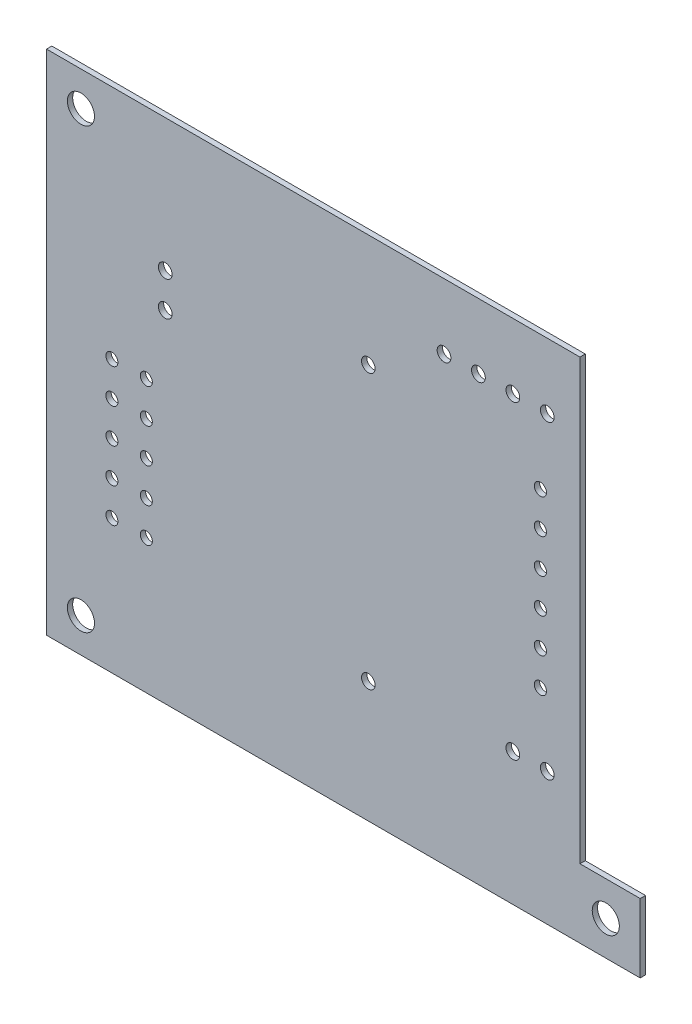
ISO-10303-21;
HEADER;
FILE_DESCRIPTION(('STEP AP214'),'2;1');
FILE_NAME('part.step','',(''),(''),'','','');
FILE_SCHEMA(('AUTOMOTIVE_DESIGN { 1 0 10303 214 1 1 1 1 }'));
ENDSEC;
DATA;
#1=APPLICATION_CONTEXT('core data for automotive mechanical design processes');
#2=APPLICATION_PROTOCOL_DEFINITION('international standard','automotive_design',2000,#1);
#3=PRODUCT_CONTEXT('',#1,'mechanical');
#4=PRODUCT('Part','Part','',(#3));
#5=PRODUCT_RELATED_PRODUCT_CATEGORY('part','',(#4));
#6=PRODUCT_DEFINITION_FORMATION('','',#4);
#7=PRODUCT_DEFINITION_CONTEXT('part definition',#1,'design');
#8=PRODUCT_DEFINITION('design','',#6,#7);
#9=PRODUCT_DEFINITION_SHAPE('','',#8);
#10=(LENGTH_UNIT() NAMED_UNIT(*) SI_UNIT(.MILLI.,.METRE.));
#11=(NAMED_UNIT(*) PLANE_ANGLE_UNIT() SI_UNIT($,.RADIAN.));
#12=(NAMED_UNIT(*) SI_UNIT($,.STERADIAN.) SOLID_ANGLE_UNIT());
#13=UNCERTAINTY_MEASURE_WITH_UNIT(LENGTH_MEASURE(1.E-05),#10,'distance_accuracy_value','');
#14=(GEOMETRIC_REPRESENTATION_CONTEXT(3) GLOBAL_UNCERTAINTY_ASSIGNED_CONTEXT((#13)) GLOBAL_UNIT_ASSIGNED_CONTEXT((#10,
#11,#12)) REPRESENTATION_CONTEXT('',''));
#15=CARTESIAN_POINT('',(0.,0.,0.));
#16=DIRECTION('',(0.,0.,1.));
#17=DIRECTION('',(1.,0.,0.));
#18=AXIS2_PLACEMENT_3D('',#15,#16,#17);
#19=CARTESIAN_POINT('',(39.37,37.465,0.));
#20=DIRECTION('',(0.,0.,-1.));
#21=DIRECTION('',(-1.,0.,0.));
#22=AXIS2_PLACEMENT_3D('',#19,#20,#21);
#23=PLANE('',#22);
#24=CARTESIAN_POINT('',(36.957,32.639,0.));
#25=DIRECTION('',(0.,0.,-1.));
#26=DIRECTION('',(-1.,0.,0.));
#27=AXIS2_PLACEMENT_3D('',#24,#25,#26);
#28=CIRCLE('',#27,0.508);
#29=CARTESIAN_POINT('',(36.449,32.639,0.));
#30=VERTEX_POINT('',#29);
#31=EDGE_CURVE('E176',#30,#30,#28,.F.);
#32=ORIENTED_EDGE('',*,*,#31,.T.);
#33=EDGE_LOOP('',(#32));
#34=FACE_BOUND('',#33,.T.);
#35=CARTESIAN_POINT('',(36.449,27.559,0.));
#36=DIRECTION('',(0.,0.,-1.));
#37=DIRECTION('',(-1.,0.,0.));
#38=AXIS2_PLACEMENT_3D('',#35,#36,#37);
#39=CIRCLE('',#38,0.4499991);
#40=CARTESIAN_POINT('',(35.9990009,27.559,0.));
#41=VERTEX_POINT('',#40);
#42=EDGE_CURVE('E179',#41,#41,#39,.F.);
#43=ORIENTED_EDGE('',*,*,#42,.T.);
#44=EDGE_LOOP('',(#43));
#45=FACE_BOUND('',#44,.T.);
#46=CARTESIAN_POINT('',(36.449,19.939,0.));
#47=DIRECTION('',(0.,0.,-1.));
#48=DIRECTION('',(-1.,0.,0.));
#49=AXIS2_PLACEMENT_3D('',#46,#47,#48);
#50=CIRCLE('',#49,0.4499991);
#51=CARTESIAN_POINT('',(35.9990009,19.939,0.));
#52=VERTEX_POINT('',#51);
#53=EDGE_CURVE('E182',#52,#52,#50,.F.);
#54=ORIENTED_EDGE('',*,*,#53,.T.);
#55=EDGE_LOOP('',(#54));
#56=FACE_BOUND('',#55,.T.);
#57=CARTESIAN_POINT('',(36.449,25.019,0.));
#58=DIRECTION('',(0.,0.,-1.));
#59=DIRECTION('',(-1.,0.,0.));
#60=AXIS2_PLACEMENT_3D('',#57,#58,#59);
#61=CIRCLE('',#60,0.4499991);
#62=CARTESIAN_POINT('',(35.9990009,25.019,0.));
#63=VERTEX_POINT('',#62);
#64=EDGE_CURVE('E185',#63,#63,#61,.F.);
#65=ORIENTED_EDGE('',*,*,#64,.T.);
#66=EDGE_LOOP('',(#65));
#67=FACE_BOUND('',#66,.T.);
#68=CARTESIAN_POINT('',(31.877,32.639,0.));
#69=DIRECTION('',(0.,0.,-1.));
#70=DIRECTION('',(-1.,0.,0.));
#71=AXIS2_PLACEMENT_3D('',#68,#69,#70);
#72=CIRCLE('',#71,0.508);
#73=CARTESIAN_POINT('',(31.369,32.639,0.));
#74=VERTEX_POINT('',#73);
#75=EDGE_CURVE('E188',#74,#74,#72,.F.);
#76=ORIENTED_EDGE('',*,*,#75,.T.);
#77=EDGE_LOOP('',(#76));
#78=FACE_BOUND('',#77,.T.);
#79=CARTESIAN_POINT('',(29.337,32.639,0.));
#80=DIRECTION('',(0.,0.,-1.));
#81=DIRECTION('',(-1.,0.,0.));
#82=AXIS2_PLACEMENT_3D('',#79,#80,#81);
#83=CIRCLE('',#82,0.508);
#84=CARTESIAN_POINT('',(28.829,32.639,0.));
#85=VERTEX_POINT('',#84);
#86=EDGE_CURVE('E191',#85,#85,#83,.F.);
#87=ORIENTED_EDGE('',*,*,#86,.T.);
#88=EDGE_LOOP('',(#87));
#89=FACE_BOUND('',#88,.T.);
#90=CARTESIAN_POINT('',(36.449,22.479,0.));
#91=DIRECTION('',(0.,0.,-1.));
#92=DIRECTION('',(-1.,0.,0.));
#93=AXIS2_PLACEMENT_3D('',#90,#91,#92);
#94=CIRCLE('',#93,0.4499991);
#95=CARTESIAN_POINT('',(35.9990009,22.479,0.));
#96=VERTEX_POINT('',#95);
#97=EDGE_CURVE('E194',#96,#96,#94,.F.);
#98=ORIENTED_EDGE('',*,*,#97,.T.);
#99=EDGE_LOOP('',(#98));
#100=FACE_BOUND('',#99,.T.);
#101=CARTESIAN_POINT('',(34.417,32.639,0.));
#102=DIRECTION('',(0.,0.,-1.));
#103=DIRECTION('',(-1.,0.,0.));
#104=AXIS2_PLACEMENT_3D('',#101,#102,#103);
#105=CIRCLE('',#104,0.508);
#106=CARTESIAN_POINT('',(33.909,32.639,0.));
#107=VERTEX_POINT('',#106);
#108=EDGE_CURVE('E197',#107,#107,#105,.F.);
#109=ORIENTED_EDGE('',*,*,#108,.T.);
#110=EDGE_LOOP('',(#109));
#111=FACE_BOUND('',#110,.T.);
#112=CARTESIAN_POINT('',(36.957,9.779,0.));
#113=DIRECTION('',(0.,0.,-1.));
#114=DIRECTION('',(-1.,0.,0.));
#115=AXIS2_PLACEMENT_3D('',#112,#113,#114);
#116=CIRCLE('',#115,0.508);
#117=CARTESIAN_POINT('',(36.449,9.779,0.));
#118=VERTEX_POINT('',#117);
#119=EDGE_CURVE('E200',#118,#118,#116,.F.);
#120=ORIENTED_EDGE('',*,*,#119,.T.);
#121=EDGE_LOOP('',(#120));
#122=FACE_BOUND('',#121,.T.);
#123=CARTESIAN_POINT('',(41.275,2.54,0.));
#124=DIRECTION('',(0.,0.,-1.));
#125=DIRECTION('',(-1.,0.,0.));
#126=AXIS2_PLACEMENT_3D('',#123,#124,#125);
#127=CIRCLE('',#126,1.00000054);
#128=CARTESIAN_POINT('',(40.27499946,2.54,0.));
#129=VERTEX_POINT('',#128);
#130=EDGE_CURVE('E203',#129,#129,#127,.F.);
#131=ORIENTED_EDGE('',*,*,#130,.T.);
#132=EDGE_LOOP('',(#131));
#133=FACE_BOUND('',#132,.T.);
#134=CARTESIAN_POINT('',(36.449,14.859,0.));
#135=DIRECTION('',(0.,0.,-1.));
#136=DIRECTION('',(-1.,0.,0.));
#137=AXIS2_PLACEMENT_3D('',#134,#135,#136);
#138=CIRCLE('',#137,0.4499991);
#139=CARTESIAN_POINT('',(35.9990009,14.859,0.));
#140=VERTEX_POINT('',#139);
#141=EDGE_CURVE('E206',#140,#140,#138,.F.);
#142=ORIENTED_EDGE('',*,*,#141,.T.);
#143=EDGE_LOOP('',(#142));
#144=FACE_BOUND('',#143,.T.);
#145=CARTESIAN_POINT('',(36.449,17.399,0.));
#146=DIRECTION('',(0.,0.,-1.));
#147=DIRECTION('',(-1.,0.,0.));
#148=AXIS2_PLACEMENT_3D('',#145,#146,#147);
#149=CIRCLE('',#148,0.4499991);
#150=CARTESIAN_POINT('',(35.9990009,17.399,0.));
#151=VERTEX_POINT('',#150);
#152=EDGE_CURVE('E209',#151,#151,#149,.F.);
#153=ORIENTED_EDGE('',*,*,#152,.T.);
#154=EDGE_LOOP('',(#153));
#155=FACE_BOUND('',#154,.T.);
#156=CARTESIAN_POINT('',(34.417,9.779,0.));
#157=DIRECTION('',(0.,0.,-1.));
#158=DIRECTION('',(-1.,0.,0.));
#159=AXIS2_PLACEMENT_3D('',#156,#157,#158);
#160=CIRCLE('',#159,0.508);
#161=CARTESIAN_POINT('',(33.909,9.779,0.));
#162=VERTEX_POINT('',#161);
#163=EDGE_CURVE('E212',#162,#162,#160,.F.);
#164=ORIENTED_EDGE('',*,*,#163,.T.);
#165=EDGE_LOOP('',(#164));
#166=FACE_BOUND('',#165,.T.);
#167=CARTESIAN_POINT('',(23.749,8.9339928,0.));
#168=DIRECTION('',(0.,0.,-1.));
#169=DIRECTION('',(-1.,0.,0.));
#170=AXIS2_PLACEMENT_3D('',#167,#168,#169);
#171=CIRCLE('',#170,0.499999);
#172=CARTESIAN_POINT('',(23.249001,8.9339928,0.));
#173=VERTEX_POINT('',#172);
#174=EDGE_CURVE('E215',#173,#173,#171,.F.);
#175=ORIENTED_EDGE('',*,*,#174,.T.);
#176=EDGE_LOOP('',(#175));
#177=FACE_BOUND('',#176,.T.);
#178=CARTESIAN_POINT('',(23.749,29.1589968,0.));
#179=DIRECTION('',(0.,0.,-1.));
#180=DIRECTION('',(-1.,0.,0.));
#181=AXIS2_PLACEMENT_3D('',#178,#179,#180);
#182=CIRCLE('',#181,0.499999);
#183=CARTESIAN_POINT('',(23.249001,29.1589968,0.));
#184=VERTEX_POINT('',#183);
#185=EDGE_CURVE('E218',#184,#184,#182,.F.);
#186=ORIENTED_EDGE('',*,*,#185,.T.);
#187=EDGE_LOOP('',(#186));
#188=FACE_BOUND('',#187,.T.);
#189=CARTESIAN_POINT('',(8.763,27.686,0.));
#190=DIRECTION('',(0.,0.,-1.));
#191=DIRECTION('',(-1.,0.,0.));
#192=AXIS2_PLACEMENT_3D('',#189,#190,#191);
#193=CIRCLE('',#192,0.508);
#194=CARTESIAN_POINT('',(8.255,27.686,0.));
#195=VERTEX_POINT('',#194);
#196=EDGE_CURVE('E221',#195,#195,#193,.F.);
#197=ORIENTED_EDGE('',*,*,#196,.T.);
#198=EDGE_LOOP('',(#197));
#199=FACE_BOUND('',#198,.T.);
#200=CARTESIAN_POINT('',(8.763,25.146,0.));
#201=DIRECTION('',(0.,0.,-1.));
#202=DIRECTION('',(-1.,0.,0.));
#203=AXIS2_PLACEMENT_3D('',#200,#201,#202);
#204=CIRCLE('',#203,0.508);
#205=CARTESIAN_POINT('',(8.255,25.146,0.));
#206=VERTEX_POINT('',#205);
#207=EDGE_CURVE('E224',#206,#206,#204,.F.);
#208=ORIENTED_EDGE('',*,*,#207,.T.);
#209=EDGE_LOOP('',(#208));
#210=FACE_BOUND('',#209,.T.);
#211=CARTESIAN_POINT('',(7.366,17.526,0.));
#212=DIRECTION('',(0.,0.,-1.));
#213=DIRECTION('',(-1.,0.,0.));
#214=AXIS2_PLACEMENT_3D('',#211,#212,#213);
#215=CIRCLE('',#214,0.4445);
#216=CARTESIAN_POINT('',(6.9215,17.526,0.));
#217=VERTEX_POINT('',#216);
#218=EDGE_CURVE('E227',#217,#217,#215,.F.);
#219=ORIENTED_EDGE('',*,*,#218,.T.);
#220=EDGE_LOOP('',(#219));
#221=FACE_BOUND('',#220,.T.);
#222=CARTESIAN_POINT('',(7.366,20.066,0.));
#223=DIRECTION('',(0.,0.,-1.));
#224=DIRECTION('',(-1.,0.,0.));
#225=AXIS2_PLACEMENT_3D('',#222,#223,#224);
#226=CIRCLE('',#225,0.4445);
#227=CARTESIAN_POINT('',(6.9215,20.066,0.));
#228=VERTEX_POINT('',#227);
#229=EDGE_CURVE('E230',#228,#228,#226,.F.);
#230=ORIENTED_EDGE('',*,*,#229,.T.);
#231=EDGE_LOOP('',(#230));
#232=FACE_BOUND('',#231,.T.);
#233=CARTESIAN_POINT('',(2.54,34.925,0.));
#234=DIRECTION('',(0.,0.,-1.));
#235=DIRECTION('',(-1.,0.,0.));
#236=AXIS2_PLACEMENT_3D('',#233,#234,#235);
#237=CIRCLE('',#236,1.00000054);
#238=CARTESIAN_POINT('',(1.53999946,34.925,0.));
#239=VERTEX_POINT('',#238);
#240=EDGE_CURVE('E233',#239,#239,#237,.F.);
#241=ORIENTED_EDGE('',*,*,#240,.T.);
#242=EDGE_LOOP('',(#241));
#243=FACE_BOUND('',#242,.T.);
#244=CARTESIAN_POINT('',(4.826,17.526,0.));
#245=DIRECTION('',(0.,0.,-1.));
#246=DIRECTION('',(-1.,0.,0.));
#247=AXIS2_PLACEMENT_3D('',#244,#245,#246);
#248=CIRCLE('',#247,0.4445);
#249=CARTESIAN_POINT('',(4.3815,17.526,0.));
#250=VERTEX_POINT('',#249);
#251=EDGE_CURVE('E236',#250,#250,#248,.F.);
#252=ORIENTED_EDGE('',*,*,#251,.T.);
#253=EDGE_LOOP('',(#252));
#254=FACE_BOUND('',#253,.T.);
#255=CARTESIAN_POINT('',(4.826,20.066,0.));
#256=DIRECTION('',(0.,0.,-1.));
#257=DIRECTION('',(-1.,0.,0.));
#258=AXIS2_PLACEMENT_3D('',#255,#256,#257);
#259=CIRCLE('',#258,0.4445);
#260=CARTESIAN_POINT('',(4.3815,20.066,0.));
#261=VERTEX_POINT('',#260);
#262=EDGE_CURVE('E239',#261,#261,#259,.F.);
#263=ORIENTED_EDGE('',*,*,#262,.T.);
#264=EDGE_LOOP('',(#263));
#265=FACE_BOUND('',#264,.T.);
#266=CARTESIAN_POINT('',(7.366,14.986,0.));
#267=DIRECTION('',(0.,0.,-1.));
#268=DIRECTION('',(-1.,0.,0.));
#269=AXIS2_PLACEMENT_3D('',#266,#267,#268);
#270=CIRCLE('',#269,0.4445);
#271=CARTESIAN_POINT('',(6.9215,14.986,0.));
#272=VERTEX_POINT('',#271);
#273=EDGE_CURVE('E242',#272,#272,#270,.F.);
#274=ORIENTED_EDGE('',*,*,#273,.T.);
#275=EDGE_LOOP('',(#274));
#276=FACE_BOUND('',#275,.T.);
#277=CARTESIAN_POINT('',(4.826,14.986,0.));
#278=DIRECTION('',(0.,0.,-1.));
#279=DIRECTION('',(-1.,0.,0.));
#280=AXIS2_PLACEMENT_3D('',#277,#278,#279);
#281=CIRCLE('',#280,0.4445);
#282=CARTESIAN_POINT('',(4.3815,14.986,0.));
#283=VERTEX_POINT('',#282);
#284=EDGE_CURVE('E245',#283,#283,#281,.F.);
#285=ORIENTED_EDGE('',*,*,#284,.T.);
#286=EDGE_LOOP('',(#285));
#287=FACE_BOUND('',#286,.T.);
#288=CARTESIAN_POINT('',(7.366,9.906,0.));
#289=DIRECTION('',(0.,0.,-1.));
#290=DIRECTION('',(-1.,0.,0.));
#291=AXIS2_PLACEMENT_3D('',#288,#289,#290);
#292=CIRCLE('',#291,0.4445);
#293=CARTESIAN_POINT('',(6.9215,9.906,0.));
#294=VERTEX_POINT('',#293);
#295=EDGE_CURVE('E248',#294,#294,#292,.F.);
#296=ORIENTED_EDGE('',*,*,#295,.T.);
#297=EDGE_LOOP('',(#296));
#298=FACE_BOUND('',#297,.T.);
#299=CARTESIAN_POINT('',(7.366,12.446,0.));
#300=DIRECTION('',(0.,0.,-1.));
#301=DIRECTION('',(-1.,0.,0.));
#302=AXIS2_PLACEMENT_3D('',#299,#300,#301);
#303=CIRCLE('',#302,0.4445);
#304=CARTESIAN_POINT('',(6.9215,12.446,0.));
#305=VERTEX_POINT('',#304);
#306=EDGE_CURVE('E251',#305,#305,#303,.F.);
#307=ORIENTED_EDGE('',*,*,#306,.T.);
#308=EDGE_LOOP('',(#307));
#309=FACE_BOUND('',#308,.T.);
#310=CARTESIAN_POINT('',(4.826,9.906,0.));
#311=DIRECTION('',(0.,0.,-1.));
#312=DIRECTION('',(-1.,0.,0.));
#313=AXIS2_PLACEMENT_3D('',#310,#311,#312);
#314=CIRCLE('',#313,0.4445);
#315=CARTESIAN_POINT('',(4.3815,9.906,0.));
#316=VERTEX_POINT('',#315);
#317=EDGE_CURVE('E254',#316,#316,#314,.F.);
#318=ORIENTED_EDGE('',*,*,#317,.T.);
#319=EDGE_LOOP('',(#318));
#320=FACE_BOUND('',#319,.T.);
#321=CARTESIAN_POINT('',(4.826,12.446,0.));
#322=DIRECTION('',(0.,0.,-1.));
#323=DIRECTION('',(-1.,0.,0.));
#324=AXIS2_PLACEMENT_3D('',#321,#322,#323);
#325=CIRCLE('',#324,0.4445);
#326=CARTESIAN_POINT('',(4.3815,12.446,0.));
#327=VERTEX_POINT('',#326);
#328=EDGE_CURVE('E256',#327,#327,#325,.F.);
#329=ORIENTED_EDGE('',*,*,#328,.T.);
#330=EDGE_LOOP('',(#329));
#331=FACE_BOUND('',#330,.T.);
#332=CARTESIAN_POINT('',(2.54,2.54,0.));
#333=DIRECTION('',(0.,0.,-1.));
#334=DIRECTION('',(-1.,0.,0.));
#335=AXIS2_PLACEMENT_3D('',#332,#333,#334);
#336=CIRCLE('',#335,1.00000054);
#337=CARTESIAN_POINT('',(1.53999946,2.54,0.));
#338=VERTEX_POINT('',#337);
#339=EDGE_CURVE('E20',#338,#338,#336,.F.);
#340=ORIENTED_EDGE('',*,*,#339,.T.);
#341=EDGE_LOOP('',(#340));
#342=FACE_BOUND('',#341,.T.);
#343=DIRECTION('',(0.,1.,0.));
#344=VECTOR('',#343,1.);
#345=CARTESIAN_POINT('',(0.,37.465,0.));
#346=LINE('',#345,#344);
#347=CARTESIAN_POINT('',(0.,0.,0.));
#348=VERTEX_POINT('',#347);
#349=CARTESIAN_POINT('',(0.,37.465,0.));
#350=VERTEX_POINT('',#349);
#351=EDGE_CURVE('E270',#348,#350,#346,.T.);
#352=ORIENTED_EDGE('',*,*,#351,.T.);
#353=DIRECTION('',(1.,0.,0.));
#354=VECTOR('',#353,1.);
#355=CARTESIAN_POINT('',(39.37,37.465,0.));
#356=LINE('',#355,#354);
#357=CARTESIAN_POINT('',(39.37,37.465,0.));
#358=VERTEX_POINT('',#357);
#359=EDGE_CURVE('E72',#350,#358,#356,.T.);
#360=ORIENTED_EDGE('',*,*,#359,.T.);
#361=DIRECTION('',(0.,1.,0.));
#362=VECTOR('',#361,1.);
#363=CARTESIAN_POINT('',(39.37,5.08,0.));
#364=LINE('',#363,#362);
#365=CARTESIAN_POINT('',(39.37,5.08,0.));
#366=VERTEX_POINT('',#365);
#367=EDGE_CURVE('E71',#358,#366,#364,.F.);
#368=ORIENTED_EDGE('',*,*,#367,.T.);
#369=DIRECTION('',(1.,0.,0.));
#370=VECTOR('',#369,1.);
#371=CARTESIAN_POINT('',(43.815,5.08,0.));
#372=LINE('',#371,#370);
#373=CARTESIAN_POINT('',(43.815,5.08,0.));
#374=VERTEX_POINT('',#373);
#375=EDGE_CURVE('E68',#366,#374,#372,.T.);
#376=ORIENTED_EDGE('',*,*,#375,.T.);
#377=DIRECTION('',(0.,1.,0.));
#378=VECTOR('',#377,1.);
#379=CARTESIAN_POINT('',(43.815,0.,0.));
#380=LINE('',#379,#378);
#381=CARTESIAN_POINT('',(43.815,0.,0.));
#382=VERTEX_POINT('',#381);
#383=EDGE_CURVE('E280',#374,#382,#380,.F.);
#384=ORIENTED_EDGE('',*,*,#383,.T.);
#385=DIRECTION('',(1.,0.,0.));
#386=VECTOR('',#385,1.);
#387=CARTESIAN_POINT('',(0.,0.,0.));
#388=LINE('',#387,#386);
#389=EDGE_CURVE('E275',#382,#348,#388,.F.);
#390=ORIENTED_EDGE('',*,*,#389,.T.);
#391=EDGE_LOOP('',(#352,#360,#368,#376,#384,#390));
#392=FACE_BOUND('',#391,.T.);
#393=ADVANCED_FACE('F17',(#34,#45,#56,#67,#78,#89,#100,#111,#122,#133,#144,#155,#166,#177,#188,
#199,#210,#221,#232,#243,#254,#265,#276,#287,#298,#309,#320,#331,#342,#392),#23,.T.);
#394=CARTESIAN_POINT('',(39.37,5.08,0.));
#395=DIRECTION('',(-1.,0.,0.));
#396=DIRECTION('',(0.,0.,1.));
#397=AXIS2_PLACEMENT_3D('',#394,#395,#396);
#398=PLANE('',#397);
#399=ORIENTED_EDGE('',*,*,#367,.F.);
#400=DIRECTION('',(0.,0.,-1.));
#401=VECTOR('',#400,1.);
#402=CARTESIAN_POINT('',(39.37,37.465,0.));
#403=LINE('',#402,#401);
#404=CARTESIAN_POINT('',(39.37,37.465,0.39116));
#405=VERTEX_POINT('',#404);
#406=EDGE_CURVE('E264',#358,#405,#403,.F.);
#407=ORIENTED_EDGE('',*,*,#406,.T.);
#408=DIRECTION('',(0.,1.,0.));
#409=VECTOR('',#408,1.);
#410=CARTESIAN_POINT('',(39.37,37.465,0.39116));
#411=LINE('',#410,#409);
#412=CARTESIAN_POINT('',(39.37,5.08,0.39116));
#413=VERTEX_POINT('',#412);
#414=EDGE_CURVE('E88',#405,#413,#411,.F.);
#415=ORIENTED_EDGE('',*,*,#414,.T.);
#416=DIRECTION('',(0.,0.,-1.));
#417=VECTOR('',#416,1.);
#418=CARTESIAN_POINT('',(39.37,5.08,0.));
#419=LINE('',#418,#417);
#420=EDGE_CURVE('E77',#413,#366,#419,.T.);
#421=ORIENTED_EDGE('',*,*,#420,.T.);
#422=EDGE_LOOP('',(#399,#407,#415,#421));
#423=FACE_BOUND('',#422,.T.);
#424=ADVANCED_FACE('F87',(#423),#398,.F.);
#425=CARTESIAN_POINT('',(43.815,5.08,0.));
#426=DIRECTION('',(0.,-1.,0.));
#427=DIRECTION('',(0.,0.,-1.));
#428=AXIS2_PLACEMENT_3D('',#425,#426,#427);
#429=PLANE('',#428);
#430=ORIENTED_EDGE('',*,*,#420,.F.);
#431=DIRECTION('',(-1.,0.,0.));
#432=VECTOR('',#431,1.);
#433=CARTESIAN_POINT('',(39.37,5.08,0.39116));
#434=LINE('',#433,#432);
#435=CARTESIAN_POINT('',(43.815,5.08,0.39116));
#436=VERTEX_POINT('',#435);
#437=EDGE_CURVE('E294',#413,#436,#434,.F.);
#438=ORIENTED_EDGE('',*,*,#437,.T.);
#439=DIRECTION('',(0.,0.,1.));
#440=VECTOR('',#439,1.);
#441=CARTESIAN_POINT('',(43.815,5.08,0.));
#442=LINE('',#441,#440);
#443=EDGE_CURVE('E85',#436,#374,#442,.F.);
#444=ORIENTED_EDGE('',*,*,#443,.T.);
#445=ORIENTED_EDGE('',*,*,#375,.F.);
#446=EDGE_LOOP('',(#430,#438,#444,#445));
#447=FACE_BOUND('',#446,.T.);
#448=ADVANCED_FACE('F82',(#447),#429,.F.);
#449=CARTESIAN_POINT('',(43.815,0.,0.));
#450=DIRECTION('',(-1.,0.,0.));
#451=DIRECTION('',(0.,0.,1.));
#452=AXIS2_PLACEMENT_3D('',#449,#450,#451);
#453=PLANE('',#452);
#454=ORIENTED_EDGE('',*,*,#443,.F.);
#455=DIRECTION('',(0.,1.,0.));
#456=VECTOR('',#455,1.);
#457=CARTESIAN_POINT('',(43.815,37.465,0.39116));
#458=LINE('',#457,#456);
#459=CARTESIAN_POINT('',(43.815,0.,0.39116));
#460=VERTEX_POINT('',#459);
#461=EDGE_CURVE('E291',#436,#460,#458,.F.);
#462=ORIENTED_EDGE('',*,*,#461,.T.);
#463=DIRECTION('',(0.,0.,1.));
#464=VECTOR('',#463,1.);
#465=CARTESIAN_POINT('',(43.815,0.,0.));
#466=LINE('',#465,#464);
#467=EDGE_CURVE('E277',#460,#382,#466,.F.);
#468=ORIENTED_EDGE('',*,*,#467,.T.);
#469=ORIENTED_EDGE('',*,*,#383,.F.);
#470=EDGE_LOOP('',(#454,#462,#468,#469));
#471=FACE_BOUND('',#470,.T.);
#472=ADVANCED_FACE('F289',(#471),#453,.F.);
#473=CARTESIAN_POINT('',(0.,0.,0.));
#474=DIRECTION('',(0.,1.,0.));
#475=DIRECTION('',(0.,0.,1.));
#476=AXIS2_PLACEMENT_3D('',#473,#474,#475);
#477=PLANE('',#476);
#478=ORIENTED_EDGE('',*,*,#467,.F.);
#479=DIRECTION('',(-1.,0.,0.));
#480=VECTOR('',#479,1.);
#481=CARTESIAN_POINT('',(39.37,0.,0.39116));
#482=LINE('',#481,#480);
#483=CARTESIAN_POINT('',(0.,0.,0.39116));
#484=VERTEX_POINT('',#483);
#485=EDGE_CURVE('E293',#460,#484,#482,.T.);
#486=ORIENTED_EDGE('',*,*,#485,.T.);
#487=DIRECTION('',(0.,0.,-1.));
#488=VECTOR('',#487,1.);
#489=CARTESIAN_POINT('',(0.,0.,0.));
#490=LINE('',#489,#488);
#491=EDGE_CURVE('E272',#484,#348,#490,.T.);
#492=ORIENTED_EDGE('',*,*,#491,.T.);
#493=ORIENTED_EDGE('',*,*,#389,.F.);
#494=EDGE_LOOP('',(#478,#486,#492,#493));
#495=FACE_BOUND('',#494,.T.);
#496=ADVANCED_FACE('F285',(#495),#477,.F.);
#497=CARTESIAN_POINT('',(0.,37.465,0.));
#498=DIRECTION('',(1.,0.,0.));
#499=DIRECTION('',(0.,0.,-1.));
#500=AXIS2_PLACEMENT_3D('',#497,#498,#499);
#501=PLANE('',#500);
#502=ORIENTED_EDGE('',*,*,#491,.F.);
#503=DIRECTION('',(0.,1.,0.));
#504=VECTOR('',#503,1.);
#505=CARTESIAN_POINT('',(0.,37.465,0.39116));
#506=LINE('',#505,#504);
#507=CARTESIAN_POINT('',(0.,37.465,0.39116));
#508=VERTEX_POINT('',#507);
#509=EDGE_CURVE('E296',#484,#508,#506,.T.);
#510=ORIENTED_EDGE('',*,*,#509,.T.);
#511=DIRECTION('',(0.,0.,-1.));
#512=VECTOR('',#511,1.);
#513=CARTESIAN_POINT('',(0.,37.465,0.));
#514=LINE('',#513,#512);
#515=EDGE_CURVE('E35',#508,#350,#514,.T.);
#516=ORIENTED_EDGE('',*,*,#515,.T.);
#517=ORIENTED_EDGE('',*,*,#351,.F.);
#518=EDGE_LOOP('',(#502,#510,#516,#517));
#519=FACE_BOUND('',#518,.T.);
#520=ADVANCED_FACE('F305',(#519),#501,.F.);
#521=CARTESIAN_POINT('',(39.37,37.465,0.));
#522=DIRECTION('',(0.,-1.,0.));
#523=DIRECTION('',(0.,0.,-1.));
#524=AXIS2_PLACEMENT_3D('',#521,#522,#523);
#525=PLANE('',#524);
#526=ORIENTED_EDGE('',*,*,#515,.F.);
#527=DIRECTION('',(-1.,0.,0.));
#528=VECTOR('',#527,1.);
#529=CARTESIAN_POINT('',(39.37,37.465,0.39116));
#530=LINE('',#529,#528);
#531=EDGE_CURVE('E175',#508,#405,#530,.F.);
#532=ORIENTED_EDGE('',*,*,#531,.T.);
#533=ORIENTED_EDGE('',*,*,#406,.F.);
#534=ORIENTED_EDGE('',*,*,#359,.F.);
#535=EDGE_LOOP('',(#526,#532,#533,#534));
#536=FACE_BOUND('',#535,.T.);
#537=ADVANCED_FACE('F301',(#536),#525,.F.);
#538=CARTESIAN_POINT('',(2.54,2.54,0.));
#539=DIRECTION('',(0.,0.,-1.));
#540=DIRECTION('',(-1.,0.,0.));
#541=AXIS2_PLACEMENT_3D('',#538,#539,#540);
#542=CYLINDRICAL_SURFACE('',#541,1.00000054);
#543=CARTESIAN_POINT('',(2.54,2.54,0.39116));
#544=DIRECTION('',(0.,0.,-1.));
#545=DIRECTION('',(-1.,0.,0.));
#546=AXIS2_PLACEMENT_3D('',#543,#544,#545);
#547=CIRCLE('',#546,1.00000054);
#548=CARTESIAN_POINT('',(1.53999946,2.54,0.39116));
#549=VERTEX_POINT('',#548);
#550=EDGE_CURVE('E172',#549,#549,#547,.F.);
#551=ORIENTED_EDGE('',*,*,#550,.T.);
#552=EDGE_LOOP('',(#551));
#553=FACE_BOUND('',#552,.T.);
#554=ORIENTED_EDGE('',*,*,#339,.F.);
#555=EDGE_LOOP('',(#554));
#556=FACE_BOUND('',#555,.T.);
#557=ADVANCED_FACE('F313',(#553,#556),#542,.F.);
#558=CARTESIAN_POINT('',(4.826,12.446,0.));
#559=DIRECTION('',(0.,0.,-1.));
#560=DIRECTION('',(-1.,0.,0.));
#561=AXIS2_PLACEMENT_3D('',#558,#559,#560);
#562=CYLINDRICAL_SURFACE('',#561,0.4445);
#563=CARTESIAN_POINT('',(4.826,12.446,0.39116));
#564=DIRECTION('',(0.,0.,-1.));
#565=DIRECTION('',(-1.,0.,0.));
#566=AXIS2_PLACEMENT_3D('',#563,#564,#565);
#567=CIRCLE('',#566,0.4445);
#568=CARTESIAN_POINT('',(4.3815,12.446,0.39116));
#569=VERTEX_POINT('',#568);
#570=EDGE_CURVE('E169',#569,#569,#567,.F.);
#571=ORIENTED_EDGE('',*,*,#570,.T.);
#572=EDGE_LOOP('',(#571));
#573=FACE_BOUND('',#572,.T.);
#574=ORIENTED_EDGE('',*,*,#328,.F.);
#575=EDGE_LOOP('',(#574));
#576=FACE_BOUND('',#575,.T.);
#577=ADVANCED_FACE('F431',(#573,#576),#562,.F.);
#578=CARTESIAN_POINT('',(4.826,9.906,0.));
#579=DIRECTION('',(0.,0.,-1.));
#580=DIRECTION('',(-1.,0.,0.));
#581=AXIS2_PLACEMENT_3D('',#578,#579,#580);
#582=CYLINDRICAL_SURFACE('',#581,0.4445);
#583=CARTESIAN_POINT('',(4.826,9.906,0.39116));
#584=DIRECTION('',(0.,0.,-1.));
#585=DIRECTION('',(-1.,0.,0.));
#586=AXIS2_PLACEMENT_3D('',#583,#584,#585);
#587=CIRCLE('',#586,0.4445);
#588=CARTESIAN_POINT('',(4.3815,9.906,0.39116));
#589=VERTEX_POINT('',#588);
#590=EDGE_CURVE('E166',#589,#589,#587,.F.);
#591=ORIENTED_EDGE('',*,*,#590,.T.);
#592=EDGE_LOOP('',(#591));
#593=FACE_BOUND('',#592,.T.);
#594=ORIENTED_EDGE('',*,*,#317,.F.);
#595=EDGE_LOOP('',(#594));
#596=FACE_BOUND('',#595,.T.);
#597=ADVANCED_FACE('F427',(#593,#596),#582,.F.);
#598=CARTESIAN_POINT('',(7.366,12.446,0.));
#599=DIRECTION('',(0.,0.,-1.));
#600=DIRECTION('',(-1.,0.,0.));
#601=AXIS2_PLACEMENT_3D('',#598,#599,#600);
#602=CYLINDRICAL_SURFACE('',#601,0.4445);
#603=CARTESIAN_POINT('',(7.366,12.446,0.39116));
#604=DIRECTION('',(0.,0.,-1.));
#605=DIRECTION('',(-1.,0.,0.));
#606=AXIS2_PLACEMENT_3D('',#603,#604,#605);
#607=CIRCLE('',#606,0.4445);
#608=CARTESIAN_POINT('',(6.9215,12.446,0.39116));
#609=VERTEX_POINT('',#608);
#610=EDGE_CURVE('E163',#609,#609,#607,.F.);
#611=ORIENTED_EDGE('',*,*,#610,.T.);
#612=EDGE_LOOP('',(#611));
#613=FACE_BOUND('',#612,.T.);
#614=ORIENTED_EDGE('',*,*,#306,.F.);
#615=EDGE_LOOP('',(#614));
#616=FACE_BOUND('',#615,.T.);
#617=ADVANCED_FACE('F423',(#613,#616),#602,.F.);
#618=CARTESIAN_POINT('',(7.366,9.906,0.));
#619=DIRECTION('',(0.,0.,-1.));
#620=DIRECTION('',(-1.,0.,0.));
#621=AXIS2_PLACEMENT_3D('',#618,#619,#620);
#622=CYLINDRICAL_SURFACE('',#621,0.4445);
#623=CARTESIAN_POINT('',(7.366,9.906,0.39116));
#624=DIRECTION('',(0.,0.,-1.));
#625=DIRECTION('',(-1.,0.,0.));
#626=AXIS2_PLACEMENT_3D('',#623,#624,#625);
#627=CIRCLE('',#626,0.4445);
#628=CARTESIAN_POINT('',(6.9215,9.906,0.39116));
#629=VERTEX_POINT('',#628);
#630=EDGE_CURVE('E160',#629,#629,#627,.F.);
#631=ORIENTED_EDGE('',*,*,#630,.T.);
#632=EDGE_LOOP('',(#631));
#633=FACE_BOUND('',#632,.T.);
#634=ORIENTED_EDGE('',*,*,#295,.F.);
#635=EDGE_LOOP('',(#634));
#636=FACE_BOUND('',#635,.T.);
#637=ADVANCED_FACE('F419',(#633,#636),#622,.F.);
#638=CARTESIAN_POINT('',(4.826,14.986,0.));
#639=DIRECTION('',(0.,0.,-1.));
#640=DIRECTION('',(-1.,0.,0.));
#641=AXIS2_PLACEMENT_3D('',#638,#639,#640);
#642=CYLINDRICAL_SURFACE('',#641,0.4445);
#643=CARTESIAN_POINT('',(4.826,14.986,0.39116));
#644=DIRECTION('',(0.,0.,-1.));
#645=DIRECTION('',(-1.,0.,0.));
#646=AXIS2_PLACEMENT_3D('',#643,#644,#645);
#647=CIRCLE('',#646,0.4445);
#648=CARTESIAN_POINT('',(4.3815,14.986,0.39116));
#649=VERTEX_POINT('',#648);
#650=EDGE_CURVE('E157',#649,#649,#647,.F.);
#651=ORIENTED_EDGE('',*,*,#650,.T.);
#652=EDGE_LOOP('',(#651));
#653=FACE_BOUND('',#652,.T.);
#654=ORIENTED_EDGE('',*,*,#284,.F.);
#655=EDGE_LOOP('',(#654));
#656=FACE_BOUND('',#655,.T.);
#657=ADVANCED_FACE('F415',(#653,#656),#642,.F.);
#658=CARTESIAN_POINT('',(7.366,14.986,0.));
#659=DIRECTION('',(0.,0.,-1.));
#660=DIRECTION('',(-1.,0.,0.));
#661=AXIS2_PLACEMENT_3D('',#658,#659,#660);
#662=CYLINDRICAL_SURFACE('',#661,0.4445);
#663=CARTESIAN_POINT('',(7.366,14.986,0.39116));
#664=DIRECTION('',(0.,0.,-1.));
#665=DIRECTION('',(-1.,0.,0.));
#666=AXIS2_PLACEMENT_3D('',#663,#664,#665);
#667=CIRCLE('',#666,0.4445);
#668=CARTESIAN_POINT('',(6.9215,14.986,0.39116));
#669=VERTEX_POINT('',#668);
#670=EDGE_CURVE('E154',#669,#669,#667,.F.);
#671=ORIENTED_EDGE('',*,*,#670,.T.);
#672=EDGE_LOOP('',(#671));
#673=FACE_BOUND('',#672,.T.);
#674=ORIENTED_EDGE('',*,*,#273,.F.);
#675=EDGE_LOOP('',(#674));
#676=FACE_BOUND('',#675,.T.);
#677=ADVANCED_FACE('F411',(#673,#676),#662,.F.);
#678=CARTESIAN_POINT('',(4.826,20.066,0.));
#679=DIRECTION('',(0.,0.,-1.));
#680=DIRECTION('',(-1.,0.,0.));
#681=AXIS2_PLACEMENT_3D('',#678,#679,#680);
#682=CYLINDRICAL_SURFACE('',#681,0.4445);
#683=CARTESIAN_POINT('',(4.826,20.066,0.39116));
#684=DIRECTION('',(0.,0.,-1.));
#685=DIRECTION('',(-1.,0.,0.));
#686=AXIS2_PLACEMENT_3D('',#683,#684,#685);
#687=CIRCLE('',#686,0.4445);
#688=CARTESIAN_POINT('',(4.3815,20.066,0.39116));
#689=VERTEX_POINT('',#688);
#690=EDGE_CURVE('E151',#689,#689,#687,.F.);
#691=ORIENTED_EDGE('',*,*,#690,.T.);
#692=EDGE_LOOP('',(#691));
#693=FACE_BOUND('',#692,.T.);
#694=ORIENTED_EDGE('',*,*,#262,.F.);
#695=EDGE_LOOP('',(#694));
#696=FACE_BOUND('',#695,.T.);
#697=ADVANCED_FACE('F407',(#693,#696),#682,.F.);
#698=CARTESIAN_POINT('',(4.826,17.526,0.));
#699=DIRECTION('',(0.,0.,-1.));
#700=DIRECTION('',(-1.,0.,0.));
#701=AXIS2_PLACEMENT_3D('',#698,#699,#700);
#702=CYLINDRICAL_SURFACE('',#701,0.4445);
#703=CARTESIAN_POINT('',(4.826,17.526,0.39116));
#704=DIRECTION('',(0.,0.,-1.));
#705=DIRECTION('',(-1.,0.,0.));
#706=AXIS2_PLACEMENT_3D('',#703,#704,#705);
#707=CIRCLE('',#706,0.4445);
#708=CARTESIAN_POINT('',(4.3815,17.526,0.39116));
#709=VERTEX_POINT('',#708);
#710=EDGE_CURVE('E148',#709,#709,#707,.F.);
#711=ORIENTED_EDGE('',*,*,#710,.T.);
#712=EDGE_LOOP('',(#711));
#713=FACE_BOUND('',#712,.T.);
#714=ORIENTED_EDGE('',*,*,#251,.F.);
#715=EDGE_LOOP('',(#714));
#716=FACE_BOUND('',#715,.T.);
#717=ADVANCED_FACE('F403',(#713,#716),#702,.F.);
#718=CARTESIAN_POINT('',(2.54,34.925,0.));
#719=DIRECTION('',(0.,0.,-1.));
#720=DIRECTION('',(-1.,0.,0.));
#721=AXIS2_PLACEMENT_3D('',#718,#719,#720);
#722=CYLINDRICAL_SURFACE('',#721,1.00000054);
#723=CARTESIAN_POINT('',(2.54,34.925,0.39116));
#724=DIRECTION('',(0.,0.,-1.));
#725=DIRECTION('',(-1.,0.,0.));
#726=AXIS2_PLACEMENT_3D('',#723,#724,#725);
#727=CIRCLE('',#726,1.00000054);
#728=CARTESIAN_POINT('',(1.53999946,34.925,0.39116));
#729=VERTEX_POINT('',#728);
#730=EDGE_CURVE('E145',#729,#729,#727,.F.);
#731=ORIENTED_EDGE('',*,*,#730,.T.);
#732=EDGE_LOOP('',(#731));
#733=FACE_BOUND('',#732,.T.);
#734=ORIENTED_EDGE('',*,*,#240,.F.);
#735=EDGE_LOOP('',(#734));
#736=FACE_BOUND('',#735,.T.);
#737=ADVANCED_FACE('F399',(#733,#736),#722,.F.);
#738=CARTESIAN_POINT('',(7.366,20.066,0.));
#739=DIRECTION('',(0.,0.,-1.));
#740=DIRECTION('',(-1.,0.,0.));
#741=AXIS2_PLACEMENT_3D('',#738,#739,#740);
#742=CYLINDRICAL_SURFACE('',#741,0.4445);
#743=CARTESIAN_POINT('',(7.366,20.066,0.39116));
#744=DIRECTION('',(0.,0.,-1.));
#745=DIRECTION('',(-1.,0.,0.));
#746=AXIS2_PLACEMENT_3D('',#743,#744,#745);
#747=CIRCLE('',#746,0.4445);
#748=CARTESIAN_POINT('',(6.9215,20.066,0.39116));
#749=VERTEX_POINT('',#748);
#750=EDGE_CURVE('E142',#749,#749,#747,.F.);
#751=ORIENTED_EDGE('',*,*,#750,.T.);
#752=EDGE_LOOP('',(#751));
#753=FACE_BOUND('',#752,.T.);
#754=ORIENTED_EDGE('',*,*,#229,.F.);
#755=EDGE_LOOP('',(#754));
#756=FACE_BOUND('',#755,.T.);
#757=ADVANCED_FACE('F395',(#753,#756),#742,.F.);
#758=CARTESIAN_POINT('',(7.366,17.526,0.));
#759=DIRECTION('',(0.,0.,-1.));
#760=DIRECTION('',(-1.,0.,0.));
#761=AXIS2_PLACEMENT_3D('',#758,#759,#760);
#762=CYLINDRICAL_SURFACE('',#761,0.4445);
#763=CARTESIAN_POINT('',(7.366,17.526,0.39116));
#764=DIRECTION('',(0.,0.,-1.));
#765=DIRECTION('',(-1.,0.,0.));
#766=AXIS2_PLACEMENT_3D('',#763,#764,#765);
#767=CIRCLE('',#766,0.4445);
#768=CARTESIAN_POINT('',(6.9215,17.526,0.39116));
#769=VERTEX_POINT('',#768);
#770=EDGE_CURVE('E139',#769,#769,#767,.F.);
#771=ORIENTED_EDGE('',*,*,#770,.T.);
#772=EDGE_LOOP('',(#771));
#773=FACE_BOUND('',#772,.T.);
#774=ORIENTED_EDGE('',*,*,#218,.F.);
#775=EDGE_LOOP('',(#774));
#776=FACE_BOUND('',#775,.T.);
#777=ADVANCED_FACE('F391',(#773,#776),#762,.F.);
#778=CARTESIAN_POINT('',(8.763,25.146,0.));
#779=DIRECTION('',(0.,0.,-1.));
#780=DIRECTION('',(-1.,0.,0.));
#781=AXIS2_PLACEMENT_3D('',#778,#779,#780);
#782=CYLINDRICAL_SURFACE('',#781,0.508);
#783=CARTESIAN_POINT('',(8.763,25.146,0.39116));
#784=DIRECTION('',(0.,0.,-1.));
#785=DIRECTION('',(-1.,0.,0.));
#786=AXIS2_PLACEMENT_3D('',#783,#784,#785);
#787=CIRCLE('',#786,0.508);
#788=CARTESIAN_POINT('',(8.255,25.146,0.39116));
#789=VERTEX_POINT('',#788);
#790=EDGE_CURVE('E136',#789,#789,#787,.F.);
#791=ORIENTED_EDGE('',*,*,#790,.T.);
#792=EDGE_LOOP('',(#791));
#793=FACE_BOUND('',#792,.T.);
#794=ORIENTED_EDGE('',*,*,#207,.F.);
#795=EDGE_LOOP('',(#794));
#796=FACE_BOUND('',#795,.T.);
#797=ADVANCED_FACE('F387',(#793,#796),#782,.F.);
#798=CARTESIAN_POINT('',(8.763,27.686,0.));
#799=DIRECTION('',(0.,0.,-1.));
#800=DIRECTION('',(-1.,0.,0.));
#801=AXIS2_PLACEMENT_3D('',#798,#799,#800);
#802=CYLINDRICAL_SURFACE('',#801,0.508);
#803=CARTESIAN_POINT('',(8.763,27.686,0.39116));
#804=DIRECTION('',(0.,0.,-1.));
#805=DIRECTION('',(-1.,0.,0.));
#806=AXIS2_PLACEMENT_3D('',#803,#804,#805);
#807=CIRCLE('',#806,0.508);
#808=CARTESIAN_POINT('',(8.255,27.686,0.39116));
#809=VERTEX_POINT('',#808);
#810=EDGE_CURVE('E133',#809,#809,#807,.F.);
#811=ORIENTED_EDGE('',*,*,#810,.T.);
#812=EDGE_LOOP('',(#811));
#813=FACE_BOUND('',#812,.T.);
#814=ORIENTED_EDGE('',*,*,#196,.F.);
#815=EDGE_LOOP('',(#814));
#816=FACE_BOUND('',#815,.T.);
#817=ADVANCED_FACE('F383',(#813,#816),#802,.F.);
#818=CARTESIAN_POINT('',(23.749,29.1589968,0.));
#819=DIRECTION('',(0.,0.,-1.));
#820=DIRECTION('',(-1.,0.,0.));
#821=AXIS2_PLACEMENT_3D('',#818,#819,#820);
#822=CYLINDRICAL_SURFACE('',#821,0.499999);
#823=CARTESIAN_POINT('',(23.749,29.1589968,0.39116));
#824=DIRECTION('',(0.,0.,-1.));
#825=DIRECTION('',(-1.,0.,0.));
#826=AXIS2_PLACEMENT_3D('',#823,#824,#825);
#827=CIRCLE('',#826,0.499999);
#828=CARTESIAN_POINT('',(23.249001,29.1589968,0.39116));
#829=VERTEX_POINT('',#828);
#830=EDGE_CURVE('E130',#829,#829,#827,.F.);
#831=ORIENTED_EDGE('',*,*,#830,.T.);
#832=EDGE_LOOP('',(#831));
#833=FACE_BOUND('',#832,.T.);
#834=ORIENTED_EDGE('',*,*,#185,.F.);
#835=EDGE_LOOP('',(#834));
#836=FACE_BOUND('',#835,.T.);
#837=ADVANCED_FACE('F379',(#833,#836),#822,.F.);
#838=CARTESIAN_POINT('',(23.749,8.9339928,0.));
#839=DIRECTION('',(0.,0.,-1.));
#840=DIRECTION('',(-1.,0.,0.));
#841=AXIS2_PLACEMENT_3D('',#838,#839,#840);
#842=CYLINDRICAL_SURFACE('',#841,0.499999);
#843=CARTESIAN_POINT('',(23.749,8.9339928,0.39116));
#844=DIRECTION('',(0.,0.,-1.));
#845=DIRECTION('',(-1.,0.,0.));
#846=AXIS2_PLACEMENT_3D('',#843,#844,#845);
#847=CIRCLE('',#846,0.499999);
#848=CARTESIAN_POINT('',(23.249001,8.9339928,0.39116));
#849=VERTEX_POINT('',#848);
#850=EDGE_CURVE('E127',#849,#849,#847,.F.);
#851=ORIENTED_EDGE('',*,*,#850,.T.);
#852=EDGE_LOOP('',(#851));
#853=FACE_BOUND('',#852,.T.);
#854=ORIENTED_EDGE('',*,*,#174,.F.);
#855=EDGE_LOOP('',(#854));
#856=FACE_BOUND('',#855,.T.);
#857=ADVANCED_FACE('F375',(#853,#856),#842,.F.);
#858=CARTESIAN_POINT('',(34.417,9.779,0.));
#859=DIRECTION('',(0.,0.,-1.));
#860=DIRECTION('',(-1.,0.,0.));
#861=AXIS2_PLACEMENT_3D('',#858,#859,#860);
#862=CYLINDRICAL_SURFACE('',#861,0.508);
#863=CARTESIAN_POINT('',(34.417,9.779,0.39116));
#864=DIRECTION('',(0.,0.,-1.));
#865=DIRECTION('',(-1.,0.,0.));
#866=AXIS2_PLACEMENT_3D('',#863,#864,#865);
#867=CIRCLE('',#866,0.508);
#868=CARTESIAN_POINT('',(33.909,9.779,0.39116));
#869=VERTEX_POINT('',#868);
#870=EDGE_CURVE('E124',#869,#869,#867,.F.);
#871=ORIENTED_EDGE('',*,*,#870,.T.);
#872=EDGE_LOOP('',(#871));
#873=FACE_BOUND('',#872,.T.);
#874=ORIENTED_EDGE('',*,*,#163,.F.);
#875=EDGE_LOOP('',(#874));
#876=FACE_BOUND('',#875,.T.);
#877=ADVANCED_FACE('F371',(#873,#876),#862,.F.);
#878=CARTESIAN_POINT('',(36.449,17.399,0.));
#879=DIRECTION('',(0.,0.,-1.));
#880=DIRECTION('',(-1.,0.,0.));
#881=AXIS2_PLACEMENT_3D('',#878,#879,#880);
#882=CYLINDRICAL_SURFACE('',#881,0.4499991);
#883=CARTESIAN_POINT('',(36.449,17.399,0.39116));
#884=DIRECTION('',(0.,0.,-1.));
#885=DIRECTION('',(-1.,0.,0.));
#886=AXIS2_PLACEMENT_3D('',#883,#884,#885);
#887=CIRCLE('',#886,0.4499991);
#888=CARTESIAN_POINT('',(35.9990009,17.399,0.39116));
#889=VERTEX_POINT('',#888);
#890=EDGE_CURVE('E121',#889,#889,#887,.F.);
#891=ORIENTED_EDGE('',*,*,#890,.T.);
#892=EDGE_LOOP('',(#891));
#893=FACE_BOUND('',#892,.T.);
#894=ORIENTED_EDGE('',*,*,#152,.F.);
#895=EDGE_LOOP('',(#894));
#896=FACE_BOUND('',#895,.T.);
#897=ADVANCED_FACE('F367',(#893,#896),#882,.F.);
#898=CARTESIAN_POINT('',(36.449,14.859,0.));
#899=DIRECTION('',(0.,0.,-1.));
#900=DIRECTION('',(-1.,0.,0.));
#901=AXIS2_PLACEMENT_3D('',#898,#899,#900);
#902=CYLINDRICAL_SURFACE('',#901,0.4499991);
#903=CARTESIAN_POINT('',(36.449,14.859,0.39116));
#904=DIRECTION('',(0.,0.,-1.));
#905=DIRECTION('',(-1.,0.,0.));
#906=AXIS2_PLACEMENT_3D('',#903,#904,#905);
#907=CIRCLE('',#906,0.4499991);
#908=CARTESIAN_POINT('',(35.9990009,14.859,0.39116));
#909=VERTEX_POINT('',#908);
#910=EDGE_CURVE('E118',#909,#909,#907,.F.);
#911=ORIENTED_EDGE('',*,*,#910,.T.);
#912=EDGE_LOOP('',(#911));
#913=FACE_BOUND('',#912,.T.);
#914=ORIENTED_EDGE('',*,*,#141,.F.);
#915=EDGE_LOOP('',(#914));
#916=FACE_BOUND('',#915,.T.);
#917=ADVANCED_FACE('F363',(#913,#916),#902,.F.);
#918=CARTESIAN_POINT('',(41.275,2.54,0.));
#919=DIRECTION('',(0.,0.,-1.));
#920=DIRECTION('',(-1.,0.,0.));
#921=AXIS2_PLACEMENT_3D('',#918,#919,#920);
#922=CYLINDRICAL_SURFACE('',#921,1.00000054);
#923=CARTESIAN_POINT('',(41.275,2.54,0.39116));
#924=DIRECTION('',(0.,0.,-1.));
#925=DIRECTION('',(-1.,0.,0.));
#926=AXIS2_PLACEMENT_3D('',#923,#924,#925);
#927=CIRCLE('',#926,1.00000054);
#928=CARTESIAN_POINT('',(40.27499946,2.54,0.39116));
#929=VERTEX_POINT('',#928);
#930=EDGE_CURVE('E115',#929,#929,#927,.F.);
#931=ORIENTED_EDGE('',*,*,#930,.T.);
#932=EDGE_LOOP('',(#931));
#933=FACE_BOUND('',#932,.T.);
#934=ORIENTED_EDGE('',*,*,#130,.F.);
#935=EDGE_LOOP('',(#934));
#936=FACE_BOUND('',#935,.T.);
#937=ADVANCED_FACE('F359',(#933,#936),#922,.F.);
#938=CARTESIAN_POINT('',(36.957,9.779,0.));
#939=DIRECTION('',(0.,0.,-1.));
#940=DIRECTION('',(-1.,0.,0.));
#941=AXIS2_PLACEMENT_3D('',#938,#939,#940);
#942=CYLINDRICAL_SURFACE('',#941,0.508);
#943=CARTESIAN_POINT('',(36.957,9.779,0.39116));
#944=DIRECTION('',(0.,0.,-1.));
#945=DIRECTION('',(-1.,0.,0.));
#946=AXIS2_PLACEMENT_3D('',#943,#944,#945);
#947=CIRCLE('',#946,0.508);
#948=CARTESIAN_POINT('',(36.449,9.779,0.39116));
#949=VERTEX_POINT('',#948);
#950=EDGE_CURVE('E112',#949,#949,#947,.F.);
#951=ORIENTED_EDGE('',*,*,#950,.T.);
#952=EDGE_LOOP('',(#951));
#953=FACE_BOUND('',#952,.T.);
#954=ORIENTED_EDGE('',*,*,#119,.F.);
#955=EDGE_LOOP('',(#954));
#956=FACE_BOUND('',#955,.T.);
#957=ADVANCED_FACE('F355',(#953,#956),#942,.F.);
#958=CARTESIAN_POINT('',(34.417,32.639,0.));
#959=DIRECTION('',(0.,0.,-1.));
#960=DIRECTION('',(-1.,0.,0.));
#961=AXIS2_PLACEMENT_3D('',#958,#959,#960);
#962=CYLINDRICAL_SURFACE('',#961,0.508);
#963=CARTESIAN_POINT('',(34.417,32.639,0.39116));
#964=DIRECTION('',(0.,0.,-1.));
#965=DIRECTION('',(-1.,0.,0.));
#966=AXIS2_PLACEMENT_3D('',#963,#964,#965);
#967=CIRCLE('',#966,0.508);
#968=CARTESIAN_POINT('',(33.909,32.639,0.39116));
#969=VERTEX_POINT('',#968);
#970=EDGE_CURVE('E109',#969,#969,#967,.F.);
#971=ORIENTED_EDGE('',*,*,#970,.T.);
#972=EDGE_LOOP('',(#971));
#973=FACE_BOUND('',#972,.T.);
#974=ORIENTED_EDGE('',*,*,#108,.F.);
#975=EDGE_LOOP('',(#974));
#976=FACE_BOUND('',#975,.T.);
#977=ADVANCED_FACE('F351',(#973,#976),#962,.F.);
#978=CARTESIAN_POINT('',(36.449,22.479,0.));
#979=DIRECTION('',(0.,0.,-1.));
#980=DIRECTION('',(-1.,0.,0.));
#981=AXIS2_PLACEMENT_3D('',#978,#979,#980);
#982=CYLINDRICAL_SURFACE('',#981,0.4499991);
#983=CARTESIAN_POINT('',(36.449,22.479,0.39116));
#984=DIRECTION('',(0.,0.,-1.));
#985=DIRECTION('',(-1.,0.,0.));
#986=AXIS2_PLACEMENT_3D('',#983,#984,#985);
#987=CIRCLE('',#986,0.4499991);
#988=CARTESIAN_POINT('',(35.9990009,22.479,0.39116));
#989=VERTEX_POINT('',#988);
#990=EDGE_CURVE('E106',#989,#989,#987,.F.);
#991=ORIENTED_EDGE('',*,*,#990,.T.);
#992=EDGE_LOOP('',(#991));
#993=FACE_BOUND('',#992,.T.);
#994=ORIENTED_EDGE('',*,*,#97,.F.);
#995=EDGE_LOOP('',(#994));
#996=FACE_BOUND('',#995,.T.);
#997=ADVANCED_FACE('F347',(#993,#996),#982,.F.);
#998=CARTESIAN_POINT('',(29.337,32.639,0.));
#999=DIRECTION('',(0.,0.,-1.));
#1000=DIRECTION('',(-1.,0.,0.));
#1001=AXIS2_PLACEMENT_3D('',#998,#999,#1000);
#1002=CYLINDRICAL_SURFACE('',#1001,0.508);
#1003=CARTESIAN_POINT('',(29.337,32.639,0.39116));
#1004=DIRECTION('',(0.,0.,-1.));
#1005=DIRECTION('',(-1.,0.,0.));
#1006=AXIS2_PLACEMENT_3D('',#1003,#1004,#1005);
#1007=CIRCLE('',#1006,0.508);
#1008=CARTESIAN_POINT('',(28.829,32.639,0.39116));
#1009=VERTEX_POINT('',#1008);
#1010=EDGE_CURVE('E103',#1009,#1009,#1007,.F.);
#1011=ORIENTED_EDGE('',*,*,#1010,.T.);
#1012=EDGE_LOOP('',(#1011));
#1013=FACE_BOUND('',#1012,.T.);
#1014=ORIENTED_EDGE('',*,*,#86,.F.);
#1015=EDGE_LOOP('',(#1014));
#1016=FACE_BOUND('',#1015,.T.);
#1017=ADVANCED_FACE('F343',(#1013,#1016),#1002,.F.);
#1018=CARTESIAN_POINT('',(31.877,32.639,0.));
#1019=DIRECTION('',(0.,0.,-1.));
#1020=DIRECTION('',(-1.,0.,0.));
#1021=AXIS2_PLACEMENT_3D('',#1018,#1019,#1020);
#1022=CYLINDRICAL_SURFACE('',#1021,0.508);
#1023=CARTESIAN_POINT('',(31.877,32.639,0.39116));
#1024=DIRECTION('',(0.,0.,-1.));
#1025=DIRECTION('',(-1.,0.,0.));
#1026=AXIS2_PLACEMENT_3D('',#1023,#1024,#1025);
#1027=CIRCLE('',#1026,0.508);
#1028=CARTESIAN_POINT('',(31.369,32.639,0.39116));
#1029=VERTEX_POINT('',#1028);
#1030=EDGE_CURVE('E100',#1029,#1029,#1027,.F.);
#1031=ORIENTED_EDGE('',*,*,#1030,.T.);
#1032=EDGE_LOOP('',(#1031));
#1033=FACE_BOUND('',#1032,.T.);
#1034=ORIENTED_EDGE('',*,*,#75,.F.);
#1035=EDGE_LOOP('',(#1034));
#1036=FACE_BOUND('',#1035,.T.);
#1037=ADVANCED_FACE('F339',(#1033,#1036),#1022,.F.);
#1038=CARTESIAN_POINT('',(36.449,25.019,0.));
#1039=DIRECTION('',(0.,0.,-1.));
#1040=DIRECTION('',(-1.,0.,0.));
#1041=AXIS2_PLACEMENT_3D('',#1038,#1039,#1040);
#1042=CYLINDRICAL_SURFACE('',#1041,0.4499991);
#1043=CARTESIAN_POINT('',(36.449,25.019,0.39116));
#1044=DIRECTION('',(0.,0.,-1.));
#1045=DIRECTION('',(-1.,0.,0.));
#1046=AXIS2_PLACEMENT_3D('',#1043,#1044,#1045);
#1047=CIRCLE('',#1046,0.4499991);
#1048=CARTESIAN_POINT('',(35.9990009,25.019,0.39116));
#1049=VERTEX_POINT('',#1048);
#1050=EDGE_CURVE('E97',#1049,#1049,#1047,.F.);
#1051=ORIENTED_EDGE('',*,*,#1050,.T.);
#1052=EDGE_LOOP('',(#1051));
#1053=FACE_BOUND('',#1052,.T.);
#1054=ORIENTED_EDGE('',*,*,#64,.F.);
#1055=EDGE_LOOP('',(#1054));
#1056=FACE_BOUND('',#1055,.T.);
#1057=ADVANCED_FACE('F335',(#1053,#1056),#1042,.F.);
#1058=CARTESIAN_POINT('',(36.449,19.939,0.));
#1059=DIRECTION('',(0.,0.,-1.));
#1060=DIRECTION('',(-1.,0.,0.));
#1061=AXIS2_PLACEMENT_3D('',#1058,#1059,#1060);
#1062=CYLINDRICAL_SURFACE('',#1061,0.4499991);
#1063=CARTESIAN_POINT('',(36.449,19.939,0.39116));
#1064=DIRECTION('',(0.,0.,-1.));
#1065=DIRECTION('',(-1.,0.,0.));
#1066=AXIS2_PLACEMENT_3D('',#1063,#1064,#1065);
#1067=CIRCLE('',#1066,0.4499991);
#1068=CARTESIAN_POINT('',(35.9990009,19.939,0.39116));
#1069=VERTEX_POINT('',#1068);
#1070=EDGE_CURVE('E94',#1069,#1069,#1067,.F.);
#1071=ORIENTED_EDGE('',*,*,#1070,.T.);
#1072=EDGE_LOOP('',(#1071));
#1073=FACE_BOUND('',#1072,.T.);
#1074=ORIENTED_EDGE('',*,*,#53,.F.);
#1075=EDGE_LOOP('',(#1074));
#1076=FACE_BOUND('',#1075,.T.);
#1077=ADVANCED_FACE('F331',(#1073,#1076),#1062,.F.);
#1078=CARTESIAN_POINT('',(36.449,27.559,0.));
#1079=DIRECTION('',(0.,0.,-1.));
#1080=DIRECTION('',(-1.,0.,0.));
#1081=AXIS2_PLACEMENT_3D('',#1078,#1079,#1080);
#1082=CYLINDRICAL_SURFACE('',#1081,0.4499991);
#1083=CARTESIAN_POINT('',(36.449,27.559,0.39116));
#1084=DIRECTION('',(0.,0.,-1.));
#1085=DIRECTION('',(-1.,0.,0.));
#1086=AXIS2_PLACEMENT_3D('',#1083,#1084,#1085);
#1087=CIRCLE('',#1086,0.4499991);
#1088=CARTESIAN_POINT('',(35.9990009,27.559,0.39116));
#1089=VERTEX_POINT('',#1088);
#1090=EDGE_CURVE('E26',#1089,#1089,#1087,.F.);
#1091=ORIENTED_EDGE('',*,*,#1090,.T.);
#1092=EDGE_LOOP('',(#1091));
#1093=FACE_BOUND('',#1092,.T.);
#1094=ORIENTED_EDGE('',*,*,#42,.F.);
#1095=EDGE_LOOP('',(#1094));
#1096=FACE_BOUND('',#1095,.T.);
#1097=ADVANCED_FACE('F323',(#1093,#1096),#1082,.F.);
#1098=CARTESIAN_POINT('',(36.957,32.639,0.));
#1099=DIRECTION('',(0.,0.,-1.));
#1100=DIRECTION('',(-1.,0.,0.));
#1101=AXIS2_PLACEMENT_3D('',#1098,#1099,#1100);
#1102=CYLINDRICAL_SURFACE('',#1101,0.508);
#1103=CARTESIAN_POINT('',(36.957,32.639,0.39116));
#1104=DIRECTION('',(0.,0.,-1.));
#1105=DIRECTION('',(-1.,0.,0.));
#1106=AXIS2_PLACEMENT_3D('',#1103,#1104,#1105);
#1107=CIRCLE('',#1106,0.508);
#1108=CARTESIAN_POINT('',(36.449,32.639,0.39116));
#1109=VERTEX_POINT('',#1108);
#1110=EDGE_CURVE('E11',#1109,#1109,#1107,.F.);
#1111=ORIENTED_EDGE('',*,*,#1110,.T.);
#1112=EDGE_LOOP('',(#1111));
#1113=FACE_BOUND('',#1112,.T.);
#1114=ORIENTED_EDGE('',*,*,#31,.F.);
#1115=EDGE_LOOP('',(#1114));
#1116=FACE_BOUND('',#1115,.T.);
#1117=ADVANCED_FACE('F317',(#1113,#1116),#1102,.F.);
#1118=CARTESIAN_POINT('',(39.37,37.465,0.39116));
#1119=DIRECTION('',(0.,0.,-1.));
#1120=DIRECTION('',(-1.,0.,0.));
#1121=AXIS2_PLACEMENT_3D('',#1118,#1119,#1120);
#1122=PLANE('',#1121);
#1123=ORIENTED_EDGE('',*,*,#1110,.F.);
#1124=EDGE_LOOP('',(#1123));
#1125=FACE_BOUND('',#1124,.T.);
#1126=ORIENTED_EDGE('',*,*,#1090,.F.);
#1127=EDGE_LOOP('',(#1126));
#1128=FACE_BOUND('',#1127,.T.);
#1129=ORIENTED_EDGE('',*,*,#1070,.F.);
#1130=EDGE_LOOP('',(#1129));
#1131=FACE_BOUND('',#1130,.T.);
#1132=ORIENTED_EDGE('',*,*,#1050,.F.);
#1133=EDGE_LOOP('',(#1132));
#1134=FACE_BOUND('',#1133,.T.);
#1135=ORIENTED_EDGE('',*,*,#1030,.F.);
#1136=EDGE_LOOP('',(#1135));
#1137=FACE_BOUND('',#1136,.T.);
#1138=ORIENTED_EDGE('',*,*,#1010,.F.);
#1139=EDGE_LOOP('',(#1138));
#1140=FACE_BOUND('',#1139,.T.);
#1141=ORIENTED_EDGE('',*,*,#990,.F.);
#1142=EDGE_LOOP('',(#1141));
#1143=FACE_BOUND('',#1142,.T.);
#1144=ORIENTED_EDGE('',*,*,#970,.F.);
#1145=EDGE_LOOP('',(#1144));
#1146=FACE_BOUND('',#1145,.T.);
#1147=ORIENTED_EDGE('',*,*,#950,.F.);
#1148=EDGE_LOOP('',(#1147));
#1149=FACE_BOUND('',#1148,.T.);
#1150=ORIENTED_EDGE('',*,*,#930,.F.);
#1151=EDGE_LOOP('',(#1150));
#1152=FACE_BOUND('',#1151,.T.);
#1153=ORIENTED_EDGE('',*,*,#910,.F.);
#1154=EDGE_LOOP('',(#1153));
#1155=FACE_BOUND('',#1154,.T.);
#1156=ORIENTED_EDGE('',*,*,#890,.F.);
#1157=EDGE_LOOP('',(#1156));
#1158=FACE_BOUND('',#1157,.T.);
#1159=ORIENTED_EDGE('',*,*,#870,.F.);
#1160=EDGE_LOOP('',(#1159));
#1161=FACE_BOUND('',#1160,.T.);
#1162=ORIENTED_EDGE('',*,*,#850,.F.);
#1163=EDGE_LOOP('',(#1162));
#1164=FACE_BOUND('',#1163,.T.);
#1165=ORIENTED_EDGE('',*,*,#830,.F.);
#1166=EDGE_LOOP('',(#1165));
#1167=FACE_BOUND('',#1166,.T.);
#1168=ORIENTED_EDGE('',*,*,#810,.F.);
#1169=EDGE_LOOP('',(#1168));
#1170=FACE_BOUND('',#1169,.T.);
#1171=ORIENTED_EDGE('',*,*,#790,.F.);
#1172=EDGE_LOOP('',(#1171));
#1173=FACE_BOUND('',#1172,.T.);
#1174=ORIENTED_EDGE('',*,*,#770,.F.);
#1175=EDGE_LOOP('',(#1174));
#1176=FACE_BOUND('',#1175,.T.);
#1177=ORIENTED_EDGE('',*,*,#750,.F.);
#1178=EDGE_LOOP('',(#1177));
#1179=FACE_BOUND('',#1178,.T.);
#1180=ORIENTED_EDGE('',*,*,#730,.F.);
#1181=EDGE_LOOP('',(#1180));
#1182=FACE_BOUND('',#1181,.T.);
#1183=ORIENTED_EDGE('',*,*,#710,.F.);
#1184=EDGE_LOOP('',(#1183));
#1185=FACE_BOUND('',#1184,.T.);
#1186=ORIENTED_EDGE('',*,*,#690,.F.);
#1187=EDGE_LOOP('',(#1186));
#1188=FACE_BOUND('',#1187,.T.);
#1189=ORIENTED_EDGE('',*,*,#670,.F.);
#1190=EDGE_LOOP('',(#1189));
#1191=FACE_BOUND('',#1190,.T.);
#1192=ORIENTED_EDGE('',*,*,#650,.F.);
#1193=EDGE_LOOP('',(#1192));
#1194=FACE_BOUND('',#1193,.T.);
#1195=ORIENTED_EDGE('',*,*,#630,.F.);
#1196=EDGE_LOOP('',(#1195));
#1197=FACE_BOUND('',#1196,.T.);
#1198=ORIENTED_EDGE('',*,*,#610,.F.);
#1199=EDGE_LOOP('',(#1198));
#1200=FACE_BOUND('',#1199,.T.);
#1201=ORIENTED_EDGE('',*,*,#590,.F.);
#1202=EDGE_LOOP('',(#1201));
#1203=FACE_BOUND('',#1202,.T.);
#1204=ORIENTED_EDGE('',*,*,#570,.F.);
#1205=EDGE_LOOP('',(#1204));
#1206=FACE_BOUND('',#1205,.T.);
#1207=ORIENTED_EDGE('',*,*,#550,.F.);
#1208=EDGE_LOOP('',(#1207));
#1209=FACE_BOUND('',#1208,.T.);
#1210=ORIENTED_EDGE('',*,*,#509,.F.);
#1211=ORIENTED_EDGE('',*,*,#485,.F.);
#1212=ORIENTED_EDGE('',*,*,#461,.F.);
#1213=ORIENTED_EDGE('',*,*,#437,.F.);
#1214=ORIENTED_EDGE('',*,*,#414,.F.);
#1215=ORIENTED_EDGE('',*,*,#531,.F.);
#1216=EDGE_LOOP('',(#1210,#1211,#1212,#1213,#1214,#1215));
#1217=FACE_BOUND('',#1216,.T.);
#1218=ADVANCED_FACE('F303',(#1125,#1128,#1131,#1134,#1137,#1140,#1143,#1146,#1149,#1152,#1155,
#1158,#1161,#1164,#1167,#1170,#1173,#1176,#1179,#1182,#1185,#1188,#1191,#1194,#1197,#1200,#1203,
#1206,#1209,#1217),#1122,.F.);
#1219=CLOSED_SHELL('',(#393,#424,#448,#472,#496,#520,#537,#557,#577,#597,#617,#637,#657,#677,
#697,#717,#737,#757,#777,#797,#817,#837,#857,#877,#897,#917,#937,#957,#977,#997,#1017,#1037,
#1057,#1077,#1097,#1117,#1218));
#1220=MANIFOLD_SOLID_BREP('B1',#1219);
#1221=ADVANCED_BREP_SHAPE_REPRESENTATION('',(#18,#1220),#14);
#1222=SHAPE_DEFINITION_REPRESENTATION(#9,#1221);
ENDSEC;
END-ISO-10303-21;
